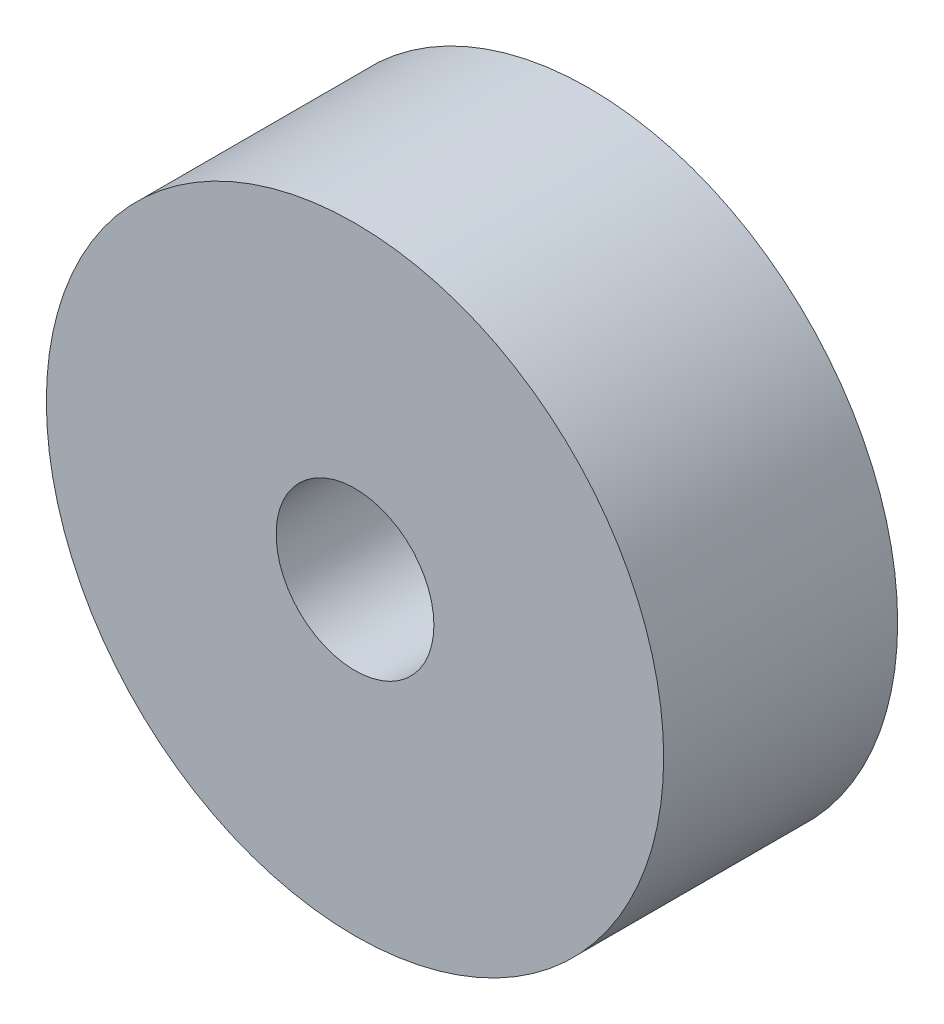
ISO-10303-21;
HEADER;
FILE_DESCRIPTION(('STEP AP214'),'2;1');
FILE_NAME('part.step','',(''),(''),'','','');
FILE_SCHEMA(('AUTOMOTIVE_DESIGN { 1 0 10303 214 1 1 1 1 }'));
ENDSEC;
DATA;
#1=APPLICATION_CONTEXT('core data for automotive mechanical design processes');
#2=APPLICATION_PROTOCOL_DEFINITION('international standard','automotive_design',2000,#1);
#3=PRODUCT_CONTEXT('',#1,'mechanical');
#4=PRODUCT('Part','Part','',(#3));
#5=PRODUCT_RELATED_PRODUCT_CATEGORY('part','',(#4));
#6=PRODUCT_DEFINITION_FORMATION('','',#4);
#7=PRODUCT_DEFINITION_CONTEXT('part definition',#1,'design');
#8=PRODUCT_DEFINITION('design','',#6,#7);
#9=PRODUCT_DEFINITION_SHAPE('','',#8);
#10=(LENGTH_UNIT() NAMED_UNIT(*) SI_UNIT(.MILLI.,.METRE.));
#11=(NAMED_UNIT(*) PLANE_ANGLE_UNIT() SI_UNIT($,.RADIAN.));
#12=(NAMED_UNIT(*) SI_UNIT($,.STERADIAN.) SOLID_ANGLE_UNIT());
#13=UNCERTAINTY_MEASURE_WITH_UNIT(LENGTH_MEASURE(1.E-05),#10,'distance_accuracy_value','');
#14=(GEOMETRIC_REPRESENTATION_CONTEXT(3) GLOBAL_UNCERTAINTY_ASSIGNED_CONTEXT((#13)) GLOBAL_UNIT_ASSIGNED_CONTEXT((#10,
#11,#12)) REPRESENTATION_CONTEXT('',''));
#15=CARTESIAN_POINT('',(0.,0.,0.));
#16=DIRECTION('',(0.,0.,1.));
#17=DIRECTION('',(1.,0.,0.));
#18=AXIS2_PLACEMENT_3D('',#15,#16,#17);
#19=CARTESIAN_POINT('',(0.,0.,4.7752));
#20=DIRECTION('',(0.,0.,1.));
#21=DIRECTION('',(1.,0.,0.));
#22=AXIS2_PLACEMENT_3D('',#19,#20,#21);
#23=PLANE('',#22);
#24=CARTESIAN_POINT('',(0.,0.,4.7752));
#25=DIRECTION('',(0.,0.,1.));
#26=DIRECTION('',(1.,0.,0.));
#27=AXIS2_PLACEMENT_3D('',#24,#25,#26);
#28=CIRCLE('',#27,6.2992);
#29=CARTESIAN_POINT('',(6.2992,0.,4.7752));
#30=VERTEX_POINT('',#29);
#31=EDGE_CURVE('E10',#30,#30,#28,.T.);
#32=ORIENTED_EDGE('',*,*,#31,.T.);
#33=EDGE_LOOP('',(#32));
#34=FACE_BOUND('',#33,.T.);
#35=CARTESIAN_POINT('',(0.,0.,4.7752));
#36=DIRECTION('',(0.,0.,1.));
#37=DIRECTION('',(1.,0.,0.));
#38=AXIS2_PLACEMENT_3D('',#35,#36,#37);
#39=CIRCLE('',#38,1.61);
#40=CARTESIAN_POINT('',(1.61,0.,4.7752));
#41=VERTEX_POINT('',#40);
#42=EDGE_CURVE('E42',#41,#41,#39,.T.);
#43=ORIENTED_EDGE('',*,*,#42,.F.);
#44=EDGE_LOOP('',(#43));
#45=FACE_BOUND('',#44,.T.);
#46=ADVANCED_FACE('F31',(#34,#45),#23,.T.);
#47=CARTESIAN_POINT('',(0.,0.,0.));
#48=DIRECTION('',(0.,0.,1.));
#49=DIRECTION('',(1.,0.,0.));
#50=AXIS2_PLACEMENT_3D('',#47,#48,#49);
#51=PLANE('',#50);
#52=CARTESIAN_POINT('',(0.,0.,0.));
#53=DIRECTION('',(0.,0.,1.));
#54=DIRECTION('',(1.,0.,0.));
#55=AXIS2_PLACEMENT_3D('',#52,#53,#54);
#56=CIRCLE('',#55,6.2992);
#57=CARTESIAN_POINT('',(6.2992,0.,0.));
#58=VERTEX_POINT('',#57);
#59=EDGE_CURVE('E35',#58,#58,#56,.T.);
#60=ORIENTED_EDGE('',*,*,#59,.F.);
#61=EDGE_LOOP('',(#60));
#62=FACE_BOUND('',#61,.T.);
#63=CARTESIAN_POINT('',(0.,0.,0.));
#64=DIRECTION('',(0.,0.,1.));
#65=DIRECTION('',(1.,0.,0.));
#66=AXIS2_PLACEMENT_3D('',#63,#64,#65);
#67=CIRCLE('',#66,1.61);
#68=CARTESIAN_POINT('',(1.61,0.,0.));
#69=VERTEX_POINT('',#68);
#70=EDGE_CURVE('E44',#69,#69,#67,.T.);
#71=ORIENTED_EDGE('',*,*,#70,.T.);
#72=EDGE_LOOP('',(#71));
#73=FACE_BOUND('',#72,.T.);
#74=ADVANCED_FACE('F54',(#62,#73),#51,.F.);
#75=CARTESIAN_POINT('',(0.,0.,4.7752));
#76=DIRECTION('',(0.,0.,-1.));
#77=DIRECTION('',(-1.,0.,0.));
#78=AXIS2_PLACEMENT_3D('',#75,#76,#77);
#79=CYLINDRICAL_SURFACE('',#78,6.2992);
#80=ORIENTED_EDGE('',*,*,#31,.F.);
#81=EDGE_LOOP('',(#80));
#82=FACE_BOUND('',#81,.T.);
#83=ORIENTED_EDGE('',*,*,#59,.T.);
#84=EDGE_LOOP('',(#83));
#85=FACE_BOUND('',#84,.T.);
#86=ADVANCED_FACE('F33',(#82,#85),#79,.T.);
#87=CARTESIAN_POINT('',(0.,0.,4.7752));
#88=DIRECTION('',(0.,0.,-1.));
#89=DIRECTION('',(-1.,0.,0.));
#90=AXIS2_PLACEMENT_3D('',#87,#88,#89);
#91=CYLINDRICAL_SURFACE('',#90,1.61);
#92=ORIENTED_EDGE('',*,*,#42,.T.);
#93=EDGE_LOOP('',(#92));
#94=FACE_BOUND('',#93,.T.);
#95=ORIENTED_EDGE('',*,*,#70,.F.);
#96=EDGE_LOOP('',(#95));
#97=FACE_BOUND('',#96,.T.);
#98=ADVANCED_FACE('F50',(#94,#97),#91,.F.);
#99=CLOSED_SHELL('',(#46,#74,#86,#98));
#100=MANIFOLD_SOLID_BREP('B2',#99);
#101=ADVANCED_BREP_SHAPE_REPRESENTATION('',(#18,#100),#14);
#102=SHAPE_DEFINITION_REPRESENTATION(#9,#101);
ENDSEC;
END-ISO-10303-21;
